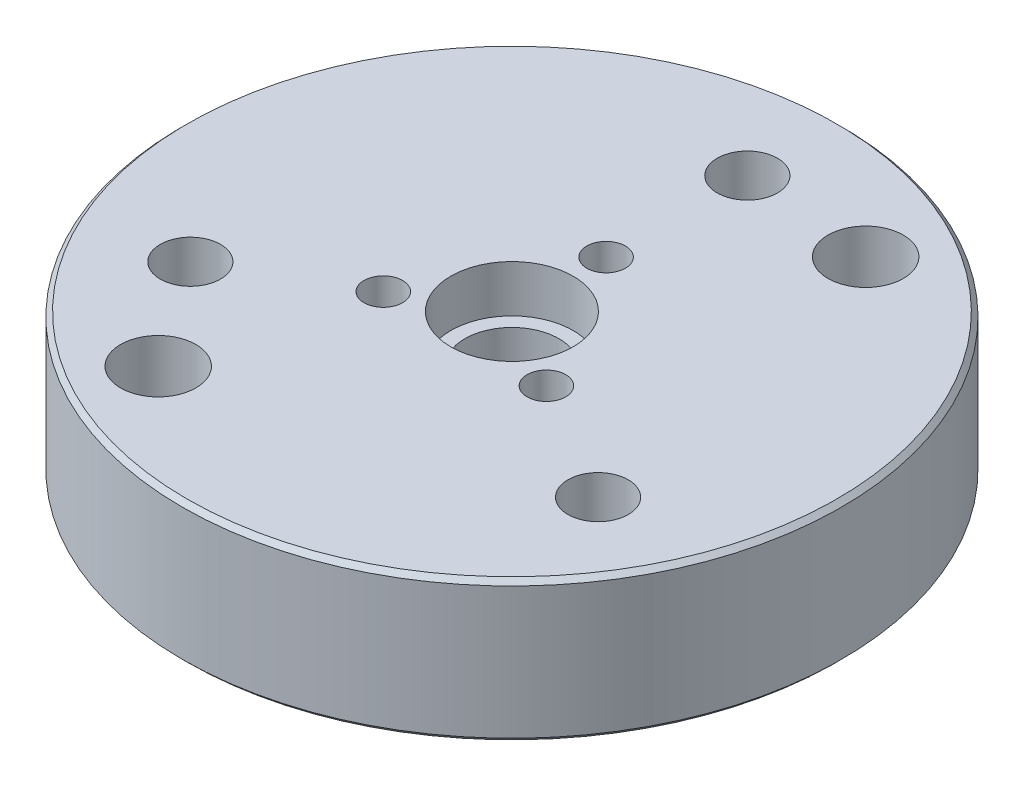
ISO-10303-21;
HEADER;
FILE_DESCRIPTION(('STEP AP214'),'2;1');
FILE_NAME('part.step','',(''),(''),'','','');
FILE_SCHEMA(('AUTOMOTIVE_DESIGN { 1 0 10303 214 1 1 1 1 }'));
ENDSEC;
DATA;
#1=APPLICATION_CONTEXT('core data for automotive mechanical design processes');
#2=APPLICATION_PROTOCOL_DEFINITION('international standard','automotive_design',2000,#1);
#3=PRODUCT_CONTEXT('',#1,'mechanical');
#4=PRODUCT('Part','Part','',(#3));
#5=PRODUCT_RELATED_PRODUCT_CATEGORY('part','',(#4));
#6=PRODUCT_DEFINITION_FORMATION('','',#4);
#7=PRODUCT_DEFINITION_CONTEXT('part definition',#1,'design');
#8=PRODUCT_DEFINITION('design','',#6,#7);
#9=PRODUCT_DEFINITION_SHAPE('','',#8);
#10=(LENGTH_UNIT() NAMED_UNIT(*) SI_UNIT(.MILLI.,.METRE.));
#11=(NAMED_UNIT(*) PLANE_ANGLE_UNIT() SI_UNIT($,.RADIAN.));
#12=(NAMED_UNIT(*) SI_UNIT($,.STERADIAN.) SOLID_ANGLE_UNIT());
#13=UNCERTAINTY_MEASURE_WITH_UNIT(LENGTH_MEASURE(1.E-05),#10,'distance_accuracy_value','');
#14=(GEOMETRIC_REPRESENTATION_CONTEXT(3) GLOBAL_UNCERTAINTY_ASSIGNED_CONTEXT((#13)) GLOBAL_UNIT_ASSIGNED_CONTEXT((#10,
#11,#12)) REPRESENTATION_CONTEXT('',''));
#15=CARTESIAN_POINT('',(0.,0.,0.));
#16=DIRECTION('',(0.,0.,1.));
#17=DIRECTION('',(1.,0.,0.));
#18=AXIS2_PLACEMENT_3D('',#15,#16,#17);
#19=CARTESIAN_POINT('',(0.,-0.000999999999999265,0.));
#20=DIRECTION('',(0.,1.,0.));
#21=DIRECTION('',(0.,0.,1.));
#22=AXIS2_PLACEMENT_3D('',#19,#20,#21);
#23=CYLINDRICAL_SURFACE('',#22,5.);
#24=CARTESIAN_POINT('',(0.,0.,0.));
#25=DIRECTION('',(0.,1.,0.));
#26=DIRECTION('',(0.,0.,1.));
#27=AXIS2_PLACEMENT_3D('',#24,#25,#26);
#28=CIRCLE('',#27,5.);
#29=CARTESIAN_POINT('',(0.,0.,5.));
#30=VERTEX_POINT('',#29);
#31=EDGE_CURVE('E61',#30,#30,#28,.F.);
#32=CARTESIAN_POINT('',(0.,10.,0.));
#33=DIRECTION('',(0.,1.,0.));
#34=DIRECTION('',(0.,0.,1.));
#35=AXIS2_PLACEMENT_3D('',#32,#33,#34);
#36=CIRCLE('',#35,5.);
#37=CARTESIAN_POINT('',(0.,10.,5.));
#38=VERTEX_POINT('',#37);
#39=EDGE_CURVE('E62',#38,#38,#36,.F.);
#40=CARTESIAN_POINT('',(0.,0.,5.));
#41=CARTESIAN_POINT('',(0.,0.104166666666667,5.));
#42=CARTESIAN_POINT('',(0.,0.208333333333333,5.));
#43=CARTESIAN_POINT('',(0.,0.416666666666667,5.));
#44=CARTESIAN_POINT('',(0.,0.520833333333333,5.));
#45=CARTESIAN_POINT('',(0.,0.729166666666667,5.));
#46=CARTESIAN_POINT('',(0.,0.833333333333333,5.));
#47=CARTESIAN_POINT('',(0.,1.04166666666667,5.));
#48=CARTESIAN_POINT('',(0.,1.14583333333333,5.));
#49=CARTESIAN_POINT('',(0.,1.35416666666667,5.));
#50=CARTESIAN_POINT('',(0.,1.45833333333333,5.));
#51=CARTESIAN_POINT('',(0.,1.66666666666667,5.));
#52=CARTESIAN_POINT('',(0.,1.77083333333333,5.));
#53=CARTESIAN_POINT('',(0.,1.97916666666667,5.));
#54=CARTESIAN_POINT('',(0.,2.08333333333333,5.));
#55=CARTESIAN_POINT('',(0.,2.29166666666667,5.));
#56=CARTESIAN_POINT('',(0.,2.39583333333333,5.));
#57=CARTESIAN_POINT('',(0.,2.60416666666667,5.));
#58=CARTESIAN_POINT('',(0.,2.70833333333333,5.));
#59=CARTESIAN_POINT('',(0.,2.91666666666667,5.));
#60=CARTESIAN_POINT('',(0.,3.02083333333333,5.));
#61=CARTESIAN_POINT('',(0.,3.22916666666667,5.));
#62=CARTESIAN_POINT('',(0.,3.33333333333333,5.));
#63=CARTESIAN_POINT('',(0.,3.54166666666667,5.));
#64=CARTESIAN_POINT('',(0.,3.64583333333333,5.));
#65=CARTESIAN_POINT('',(0.,3.85416666666667,5.));
#66=CARTESIAN_POINT('',(0.,3.95833333333333,5.));
#67=CARTESIAN_POINT('',(0.,4.16666666666667,5.));
#68=CARTESIAN_POINT('',(0.,4.27083333333333,5.));
#69=CARTESIAN_POINT('',(0.,4.47916666666667,5.));
#70=CARTESIAN_POINT('',(0.,4.58333333333333,5.));
#71=CARTESIAN_POINT('',(0.,4.79166666666667,5.));
#72=CARTESIAN_POINT('',(0.,4.89583333333333,5.));
#73=CARTESIAN_POINT('',(0.,5.10416666666667,5.));
#74=CARTESIAN_POINT('',(0.,5.20833333333333,5.));
#75=CARTESIAN_POINT('',(0.,5.41666666666667,5.));
#76=CARTESIAN_POINT('',(0.,5.52083333333333,5.));
#77=CARTESIAN_POINT('',(0.,5.72916666666667,5.));
#78=CARTESIAN_POINT('',(0.,5.83333333333333,5.));
#79=CARTESIAN_POINT('',(0.,6.04166666666667,5.));
#80=CARTESIAN_POINT('',(0.,6.14583333333333,5.));
#81=CARTESIAN_POINT('',(0.,6.35416666666667,5.));
#82=CARTESIAN_POINT('',(0.,6.45833333333333,5.));
#83=CARTESIAN_POINT('',(0.,6.66666666666667,5.));
#84=CARTESIAN_POINT('',(0.,6.77083333333333,5.));
#85=CARTESIAN_POINT('',(0.,6.97916666666667,5.));
#86=CARTESIAN_POINT('',(0.,7.08333333333333,5.));
#87=CARTESIAN_POINT('',(0.,7.29166666666667,5.));
#88=CARTESIAN_POINT('',(0.,7.39583333333333,5.));
#89=CARTESIAN_POINT('',(0.,7.60416666666667,5.));
#90=CARTESIAN_POINT('',(0.,7.70833333333333,5.));
#91=CARTESIAN_POINT('',(0.,7.91666666666667,5.));
#92=CARTESIAN_POINT('',(0.,8.02083333333333,5.));
#93=CARTESIAN_POINT('',(0.,8.22916666666667,5.));
#94=CARTESIAN_POINT('',(0.,8.33333333333333,5.));
#95=CARTESIAN_POINT('',(0.,8.54166666666667,5.));
#96=CARTESIAN_POINT('',(0.,8.64583333333333,5.));
#97=CARTESIAN_POINT('',(0.,8.85416666666666,5.));
#98=CARTESIAN_POINT('',(0.,8.95833333333333,5.));
#99=CARTESIAN_POINT('',(0.,9.16666666666666,5.));
#100=CARTESIAN_POINT('',(0.,9.27083333333333,5.));
#101=CARTESIAN_POINT('',(0.,9.47916666666667,5.));
#102=CARTESIAN_POINT('',(0.,9.58333333333333,5.));
#103=CARTESIAN_POINT('',(0.,9.79166666666667,5.));
#104=CARTESIAN_POINT('',(0.,9.89583333333333,5.));
#105=CARTESIAN_POINT('',(0.,10.,5.));
#106=B_SPLINE_CURVE_WITH_KNOTS('',3,(#40,#41,#42,#43,#44,#45,#46,#47,#48,#49,#50,#51,#52,#53,
#54,#55,#56,#57,#58,#59,#60,#61,#62,#63,#64,#65,#66,#67,#68,#69,#70,#71,#72,#73,#74,#75,#76,#77,
#78,#79,#80,#81,#82,#83,#84,#85,#86,#87,#88,#89,#90,#91,#92,#93,#94,#95,#96,#97,#98,#99,#100,
#101,#102,#103,#104,#105),.UNSPECIFIED.,.F.,.F.,(4,2,2,2,2,2,2,2,2,2,2,2,2,2,2,2,2,2,2,2,2,2,2,
2,2,2,2,2,2,2,2,2,4),(0.,0.3125,0.625,0.9375,1.25,1.5625,1.875,2.1875,2.5,2.8125,3.125,3.4375,
3.75,4.0625,4.375,4.6875,5.,5.3125,5.625,5.9375,6.25,6.5625,6.875,7.1875,7.5,7.8125,8.125,
8.4375,8.75,9.0625,9.375,9.6875,10.),.UNSPECIFIED.);
#107=EDGE_CURVE('BSEAM40',#30,#38,#106,.T.);
#108=ORIENTED_EDGE('',*,*,#31,.T.);
#109=ORIENTED_EDGE('',*,*,#39,.F.);
#110=ORIENTED_EDGE('',*,*,#107,.T.);
#111=ORIENTED_EDGE('',*,*,#107,.F.);
#112=EDGE_LOOP('',(#108,#110,#109,#111));
#113=FACE_BOUND('',#112,.T.);
#114=ADVANCED_FACE('F40',(#113),#23,.F.);
#115=CARTESIAN_POINT('',(0.,15.,0.));
#116=DIRECTION('',(0.,-1.,0.));
#117=DIRECTION('',(0.,0.,-1.));
#118=AXIS2_PLACEMENT_3D('',#115,#116,#117);
#119=CYLINDRICAL_SURFACE('',#118,35.);
#120=CARTESIAN_POINT('',(0.,0.500000000000014,0.));
#121=DIRECTION('',(0.,1.,0.));
#122=DIRECTION('',(0.,0.,1.));
#123=AXIS2_PLACEMENT_3D('',#120,#121,#122);
#124=CIRCLE('',#123,35.);
#125=CARTESIAN_POINT('',(0.,0.500000000000014,35.));
#126=VERTEX_POINT('',#125);
#127=EDGE_CURVE('E52',#126,#126,#124,.T.);
#128=ORIENTED_EDGE('',*,*,#127,.T.);
#129=EDGE_LOOP('',(#128));
#130=FACE_BOUND('',#129,.T.);
#131=CARTESIAN_POINT('',(0.,14.5,0.));
#132=DIRECTION('',(0.,1.,0.));
#133=DIRECTION('',(0.,0.,1.));
#134=AXIS2_PLACEMENT_3D('',#131,#132,#133);
#135=CIRCLE('',#134,35.);
#136=CARTESIAN_POINT('',(0.,14.5,35.));
#137=VERTEX_POINT('',#136);
#138=EDGE_CURVE('E56',#137,#137,#135,.F.);
#139=ORIENTED_EDGE('',*,*,#138,.T.);
#140=EDGE_LOOP('',(#139));
#141=FACE_BOUND('',#140,.T.);
#142=ADVANCED_FACE('F148',(#130,#141),#119,.T.);
#143=CARTESIAN_POINT('',(0.,15.,0.));
#144=DIRECTION('',(0.,1.,0.));
#145=DIRECTION('',(0.,0.,1.));
#146=AXIS2_PLACEMENT_3D('',#143,#144,#145);
#147=PLANE('',#146);
#148=CARTESIAN_POINT('',(0.,15.,0.));
#149=DIRECTION('',(0.,1.,0.));
#150=DIRECTION('',(0.,0.,1.));
#151=AXIS2_PLACEMENT_3D('',#148,#149,#150);
#152=CIRCLE('',#151,34.5);
#153=CARTESIAN_POINT('',(0.,15.,34.5));
#154=VERTEX_POINT('',#153);
#155=EDGE_CURVE('E10',#154,#154,#152,.T.);
#156=ORIENTED_EDGE('',*,*,#155,.T.);
#157=EDGE_LOOP('',(#156));
#158=FACE_BOUND('',#157,.T.);
#159=CARTESIAN_POINT('',(13.75,15.,-23.815698604072));
#160=DIRECTION('',(0.,-1.,0.));
#161=DIRECTION('',(0.,0.,-1.));
#162=AXIS2_PLACEMENT_3D('',#159,#160,#161);
#163=CIRCLE('',#162,4.);
#164=CARTESIAN_POINT('',(13.75,15.,-27.815698604072));
#165=VERTEX_POINT('',#164);
#166=EDGE_CURVE('E115',#165,#165,#163,.T.);
#167=ORIENTED_EDGE('',*,*,#166,.T.);
#168=EDGE_LOOP('',(#167));
#169=FACE_BOUND('',#168,.T.);
#170=CARTESIAN_POINT('',(-13.75,15.,23.815698604072));
#171=DIRECTION('',(0.,-1.,0.));
#172=DIRECTION('',(0.,0.,-1.));
#173=AXIS2_PLACEMENT_3D('',#170,#171,#172);
#174=CIRCLE('',#173,4.);
#175=CARTESIAN_POINT('',(-13.75,15.,19.8156986040721));
#176=VERTEX_POINT('',#175);
#177=EDGE_CURVE('E109',#176,#176,#174,.T.);
#178=ORIENTED_EDGE('',*,*,#177,.T.);
#179=EDGE_LOOP('',(#178));
#180=FACE_BOUND('',#179,.T.);
#181=CARTESIAN_POINT('',(0.,15.,-25.));
#182=DIRECTION('',(0.,-1.,0.));
#183=DIRECTION('',(0.,0.,-1.));
#184=AXIS2_PLACEMENT_3D('',#181,#182,#183);
#185=CIRCLE('',#184,3.2);
#186=CARTESIAN_POINT('',(0.,15.,-28.2));
#187=VERTEX_POINT('',#186);
#188=EDGE_CURVE('E103',#187,#187,#185,.T.);
#189=ORIENTED_EDGE('',*,*,#188,.T.);
#190=EDGE_LOOP('',(#189));
#191=FACE_BOUND('',#190,.T.);
#192=CARTESIAN_POINT('',(-21.650635094611,15.,12.4999999999999));
#193=DIRECTION('',(0.,-1.,0.));
#194=DIRECTION('',(0.,0.,-1.));
#195=AXIS2_PLACEMENT_3D('',#192,#193,#194);
#196=CIRCLE('',#195,3.2);
#197=CARTESIAN_POINT('',(-21.650635094611,15.,9.29999999999995));
#198=VERTEX_POINT('',#197);
#199=EDGE_CURVE('E97',#198,#198,#196,.T.);
#200=ORIENTED_EDGE('',*,*,#199,.T.);
#201=EDGE_LOOP('',(#200));
#202=FACE_BOUND('',#201,.T.);
#203=CARTESIAN_POINT('',(21.650635094611,15.,12.5));
#204=DIRECTION('',(0.,-1.,0.));
#205=DIRECTION('',(0.,0.,-1.));
#206=AXIS2_PLACEMENT_3D('',#203,#204,#205);
#207=CIRCLE('',#206,3.2);
#208=CARTESIAN_POINT('',(21.650635094611,15.,9.29999999999996));
#209=VERTEX_POINT('',#208);
#210=EDGE_CURVE('E81',#209,#209,#207,.T.);
#211=ORIENTED_EDGE('',*,*,#210,.T.);
#212=EDGE_LOOP('',(#211));
#213=FACE_BOUND('',#212,.T.);
#214=CARTESIAN_POINT('',(0.,15.,-10.));
#215=DIRECTION('',(0.,1.,0.));
#216=DIRECTION('',(0.,0.,1.));
#217=AXIS2_PLACEMENT_3D('',#214,#215,#216);
#218=CIRCLE('',#217,2.05);
#219=CARTESIAN_POINT('',(0.,15.,-7.95));
#220=VERTEX_POINT('',#219);
#221=EDGE_CURVE('E85',#220,#220,#218,.T.);
#222=ORIENTED_EDGE('',*,*,#221,.F.);
#223=EDGE_LOOP('',(#222));
#224=FACE_BOUND('',#223,.T.);
#225=CARTESIAN_POINT('',(8.66025403784439,15.,4.99999999999998));
#226=DIRECTION('',(0.,1.,0.));
#227=DIRECTION('',(0.,0.,1.));
#228=AXIS2_PLACEMENT_3D('',#225,#226,#227);
#229=CIRCLE('',#228,2.05);
#230=CARTESIAN_POINT('',(8.66025403784439,15.,7.04999999999997));
#231=VERTEX_POINT('',#230);
#232=EDGE_CURVE('E82',#231,#231,#229,.T.);
#233=ORIENTED_EDGE('',*,*,#232,.F.);
#234=EDGE_LOOP('',(#233));
#235=FACE_BOUND('',#234,.T.);
#236=CARTESIAN_POINT('',(-8.6602540378444,15.,4.99999999999998));
#237=DIRECTION('',(0.,1.,0.));
#238=DIRECTION('',(0.,0.,1.));
#239=AXIS2_PLACEMENT_3D('',#236,#237,#238);
#240=CIRCLE('',#239,2.05);
#241=CARTESIAN_POINT('',(-8.6602540378444,15.,7.04999999999998));
#242=VERTEX_POINT('',#241);
#243=EDGE_CURVE('E74',#242,#242,#240,.T.);
#244=ORIENTED_EDGE('',*,*,#243,.F.);
#245=EDGE_LOOP('',(#244));
#246=FACE_BOUND('',#245,.T.);
#247=CARTESIAN_POINT('',(0.,15.,0.));
#248=DIRECTION('',(0.,1.,0.));
#249=DIRECTION('',(0.,0.,1.));
#250=AXIS2_PLACEMENT_3D('',#247,#248,#249);
#251=CIRCLE('',#250,6.5);
#252=CARTESIAN_POINT('',(0.,15.,6.5));
#253=VERTEX_POINT('',#252);
#254=EDGE_CURVE('E68',#253,#253,#251,.T.);
#255=ORIENTED_EDGE('',*,*,#254,.F.);
#256=EDGE_LOOP('',(#255));
#257=FACE_BOUND('',#256,.T.);
#258=ADVANCED_FACE('F128',(#158,#169,#180,#191,#202,#213,#224,#235,#246,#257),#147,.T.);
#259=CARTESIAN_POINT('',(0.,0.,0.));
#260=DIRECTION('',(0.,1.,0.));
#261=DIRECTION('',(0.,0.,1.));
#262=AXIS2_PLACEMENT_3D('',#259,#260,#261);
#263=PLANE('',#262);
#264=CARTESIAN_POINT('',(0.,0.,0.));
#265=DIRECTION('',(0.,1.,0.));
#266=DIRECTION('',(0.,0.,1.));
#267=AXIS2_PLACEMENT_3D('',#264,#265,#266);
#268=CIRCLE('',#267,34.5);
#269=CARTESIAN_POINT('',(0.,0.,34.5));
#270=VERTEX_POINT('',#269);
#271=EDGE_CURVE('E48',#270,#270,#268,.F.);
#272=ORIENTED_EDGE('',*,*,#271,.T.);
#273=EDGE_LOOP('',(#272));
#274=FACE_BOUND('',#273,.T.);
#275=CARTESIAN_POINT('',(13.75,0.,-23.815698604072));
#276=DIRECTION('',(0.,-1.,0.));
#277=DIRECTION('',(0.,0.,-1.));
#278=AXIS2_PLACEMENT_3D('',#275,#276,#277);
#279=CIRCLE('',#278,4.);
#280=CARTESIAN_POINT('',(13.75,0.,-27.815698604072));
#281=VERTEX_POINT('',#280);
#282=EDGE_CURVE('E118',#281,#281,#279,.T.);
#283=ORIENTED_EDGE('',*,*,#282,.F.);
#284=EDGE_LOOP('',(#283));
#285=FACE_BOUND('',#284,.T.);
#286=CARTESIAN_POINT('',(-13.75,0.,23.815698604072));
#287=DIRECTION('',(0.,-1.,0.));
#288=DIRECTION('',(0.,0.,-1.));
#289=AXIS2_PLACEMENT_3D('',#286,#287,#288);
#290=CIRCLE('',#289,4.);
#291=CARTESIAN_POINT('',(-13.75,0.,19.8156986040721));
#292=VERTEX_POINT('',#291);
#293=EDGE_CURVE('E112',#292,#292,#290,.T.);
#294=ORIENTED_EDGE('',*,*,#293,.F.);
#295=EDGE_LOOP('',(#294));
#296=FACE_BOUND('',#295,.T.);
#297=CARTESIAN_POINT('',(0.,0.,-25.));
#298=DIRECTION('',(0.,-1.,0.));
#299=DIRECTION('',(0.,0.,-1.));
#300=AXIS2_PLACEMENT_3D('',#297,#298,#299);
#301=CIRCLE('',#300,3.2);
#302=CARTESIAN_POINT('',(0.,0.,-28.2));
#303=VERTEX_POINT('',#302);
#304=EDGE_CURVE('E106',#303,#303,#301,.T.);
#305=ORIENTED_EDGE('',*,*,#304,.F.);
#306=EDGE_LOOP('',(#305));
#307=FACE_BOUND('',#306,.T.);
#308=CARTESIAN_POINT('',(-21.650635094611,0.,12.4999999999999));
#309=DIRECTION('',(0.,-1.,0.));
#310=DIRECTION('',(0.,0.,-1.));
#311=AXIS2_PLACEMENT_3D('',#308,#309,#310);
#312=CIRCLE('',#311,3.2);
#313=CARTESIAN_POINT('',(-21.650635094611,0.,9.29999999999995));
#314=VERTEX_POINT('',#313);
#315=EDGE_CURVE('E100',#314,#314,#312,.T.);
#316=ORIENTED_EDGE('',*,*,#315,.F.);
#317=EDGE_LOOP('',(#316));
#318=FACE_BOUND('',#317,.T.);
#319=CARTESIAN_POINT('',(21.650635094611,0.,12.5));
#320=DIRECTION('',(0.,-1.,0.));
#321=DIRECTION('',(0.,0.,-1.));
#322=AXIS2_PLACEMENT_3D('',#319,#320,#321);
#323=CIRCLE('',#322,3.2);
#324=CARTESIAN_POINT('',(21.650635094611,0.,9.29999999999996));
#325=VERTEX_POINT('',#324);
#326=EDGE_CURVE('E94',#325,#325,#323,.T.);
#327=ORIENTED_EDGE('',*,*,#326,.F.);
#328=EDGE_LOOP('',(#327));
#329=FACE_BOUND('',#328,.T.);
#330=CARTESIAN_POINT('',(0.,0.,-10.));
#331=DIRECTION('',(0.,1.,0.));
#332=DIRECTION('',(0.,0.,1.));
#333=AXIS2_PLACEMENT_3D('',#330,#331,#332);
#334=CIRCLE('',#333,2.05);
#335=CARTESIAN_POINT('',(0.,0.,-7.95));
#336=VERTEX_POINT('',#335);
#337=EDGE_CURVE('E71',#336,#336,#334,.F.);
#338=ORIENTED_EDGE('',*,*,#337,.F.);
#339=EDGE_LOOP('',(#338));
#340=FACE_BOUND('',#339,.T.);
#341=CARTESIAN_POINT('',(8.66025403784439,0.,4.99999999999998));
#342=DIRECTION('',(0.,1.,0.));
#343=DIRECTION('',(0.,0.,1.));
#344=AXIS2_PLACEMENT_3D('',#341,#342,#343);
#345=CIRCLE('',#344,2.05);
#346=CARTESIAN_POINT('',(8.66025403784439,0.,7.04999999999997));
#347=VERTEX_POINT('',#346);
#348=EDGE_CURVE('E77',#347,#347,#345,.F.);
#349=ORIENTED_EDGE('',*,*,#348,.F.);
#350=EDGE_LOOP('',(#349));
#351=FACE_BOUND('',#350,.T.);
#352=CARTESIAN_POINT('',(-8.6602540378444,0.,4.99999999999998));
#353=DIRECTION('',(0.,1.,0.));
#354=DIRECTION('',(0.,0.,1.));
#355=AXIS2_PLACEMENT_3D('',#352,#353,#354);
#356=CIRCLE('',#355,2.05);
#357=CARTESIAN_POINT('',(-8.6602540378444,0.,7.04999999999998));
#358=VERTEX_POINT('',#357);
#359=EDGE_CURVE('E78',#358,#358,#356,.F.);
#360=ORIENTED_EDGE('',*,*,#359,.F.);
#361=EDGE_LOOP('',(#360));
#362=FACE_BOUND('',#361,.T.);
#363=ORIENTED_EDGE('',*,*,#31,.F.);
#364=EDGE_LOOP('',(#363));
#365=FACE_BOUND('',#364,.T.);
#366=ADVANCED_FACE('F124',(#274,#285,#296,#307,#318,#329,#340,#351,#362,#365),#263,.F.);
#367=CARTESIAN_POINT('',(0.,10.,0.));
#368=DIRECTION('',(0.,1.,0.));
#369=DIRECTION('',(0.,0.,1.));
#370=AXIS2_PLACEMENT_3D('',#367,#368,#369);
#371=PLANE('',#370);
#372=CARTESIAN_POINT('',(0.,10.,0.));
#373=DIRECTION('',(0.,1.,0.));
#374=DIRECTION('',(0.,0.,1.));
#375=AXIS2_PLACEMENT_3D('',#372,#373,#374);
#376=CIRCLE('',#375,6.5);
#377=CARTESIAN_POINT('',(0.,10.,6.5));
#378=VERTEX_POINT('',#377);
#379=EDGE_CURVE('E65',#378,#378,#376,.T.);
#380=ORIENTED_EDGE('',*,*,#379,.T.);
#381=EDGE_LOOP('',(#380));
#382=FACE_BOUND('',#381,.T.);
#383=ORIENTED_EDGE('',*,*,#39,.T.);
#384=EDGE_LOOP('',(#383));
#385=FACE_BOUND('',#384,.T.);
#386=ADVANCED_FACE('F127',(#382,#385),#371,.T.);
#387=CARTESIAN_POINT('',(0.,10.,0.));
#388=DIRECTION('',(0.,1.,0.));
#389=DIRECTION('',(0.,0.,1.));
#390=AXIS2_PLACEMENT_3D('',#387,#388,#389);
#391=CYLINDRICAL_SURFACE('',#390,6.5);
#392=ORIENTED_EDGE('',*,*,#379,.F.);
#393=EDGE_LOOP('',(#392));
#394=FACE_BOUND('',#393,.T.);
#395=ORIENTED_EDGE('',*,*,#254,.T.);
#396=EDGE_LOOP('',(#395));
#397=FACE_BOUND('',#396,.T.);
#398=ADVANCED_FACE('F153',(#394,#397),#391,.F.);
#399=CARTESIAN_POINT('',(-8.6602540378444,-0.000999999999999265,4.99999999999998));
#400=DIRECTION('',(0.,1.,0.));
#401=DIRECTION('',(0.,0.,1.));
#402=AXIS2_PLACEMENT_3D('',#399,#400,#401);
#403=CYLINDRICAL_SURFACE('',#402,2.05);
#404=CARTESIAN_POINT('',(-8.6602540378444,15.,7.04999999999998));
#405=CARTESIAN_POINT('',(-8.6602540378444,14.84375,7.04999999999998));
#406=CARTESIAN_POINT('',(-8.6602540378444,14.6875,7.04999999999998));
#407=CARTESIAN_POINT('',(-8.6602540378444,14.375,7.04999999999998));
#408=CARTESIAN_POINT('',(-8.6602540378444,14.21875,7.04999999999998));
#409=CARTESIAN_POINT('',(-8.6602540378444,13.90625,7.04999999999998));
#410=CARTESIAN_POINT('',(-8.6602540378444,13.75,7.04999999999998));
#411=CARTESIAN_POINT('',(-8.6602540378444,13.4375,7.04999999999998));
#412=CARTESIAN_POINT('',(-8.6602540378444,13.28125,7.04999999999998));
#413=CARTESIAN_POINT('',(-8.6602540378444,12.96875,7.04999999999998));
#414=CARTESIAN_POINT('',(-8.6602540378444,12.8125,7.04999999999998));
#415=CARTESIAN_POINT('',(-8.6602540378444,12.5,7.04999999999998));
#416=CARTESIAN_POINT('',(-8.6602540378444,12.34375,7.04999999999998));
#417=CARTESIAN_POINT('',(-8.6602540378444,12.03125,7.04999999999998));
#418=CARTESIAN_POINT('',(-8.6602540378444,11.875,7.04999999999998));
#419=CARTESIAN_POINT('',(-8.6602540378444,11.5625,7.04999999999998));
#420=CARTESIAN_POINT('',(-8.6602540378444,11.40625,7.04999999999998));
#421=CARTESIAN_POINT('',(-8.6602540378444,11.09375,7.04999999999998));
#422=CARTESIAN_POINT('',(-8.6602540378444,10.9375,7.04999999999998));
#423=CARTESIAN_POINT('',(-8.6602540378444,10.625,7.04999999999998));
#424=CARTESIAN_POINT('',(-8.6602540378444,10.46875,7.04999999999998));
#425=CARTESIAN_POINT('',(-8.6602540378444,10.15625,7.04999999999998));
#426=CARTESIAN_POINT('',(-8.6602540378444,10.,7.04999999999998));
#427=CARTESIAN_POINT('',(-8.6602540378444,9.6875,7.04999999999998));
#428=CARTESIAN_POINT('',(-8.6602540378444,9.53125,7.04999999999998));
#429=CARTESIAN_POINT('',(-8.6602540378444,9.21875,7.04999999999998));
#430=CARTESIAN_POINT('',(-8.6602540378444,9.0625,7.04999999999998));
#431=CARTESIAN_POINT('',(-8.6602540378444,8.75,7.04999999999998));
#432=CARTESIAN_POINT('',(-8.6602540378444,8.59375,7.04999999999998));
#433=CARTESIAN_POINT('',(-8.6602540378444,8.28125,7.04999999999998));
#434=CARTESIAN_POINT('',(-8.6602540378444,8.125,7.04999999999998));
#435=CARTESIAN_POINT('',(-8.6602540378444,7.8125,7.04999999999998));
#436=CARTESIAN_POINT('',(-8.6602540378444,7.65625,7.04999999999998));
#437=CARTESIAN_POINT('',(-8.6602540378444,7.34375,7.04999999999998));
#438=CARTESIAN_POINT('',(-8.6602540378444,7.1875,7.04999999999998));
#439=CARTESIAN_POINT('',(-8.6602540378444,6.875,7.04999999999998));
#440=CARTESIAN_POINT('',(-8.6602540378444,6.71875,7.04999999999998));
#441=CARTESIAN_POINT('',(-8.6602540378444,6.40625,7.04999999999998));
#442=CARTESIAN_POINT('',(-8.6602540378444,6.25,7.04999999999998));
#443=CARTESIAN_POINT('',(-8.6602540378444,5.9375,7.04999999999998));
#444=CARTESIAN_POINT('',(-8.6602540378444,5.78125,7.04999999999998));
#445=CARTESIAN_POINT('',(-8.6602540378444,5.46875,7.04999999999998));
#446=CARTESIAN_POINT('',(-8.6602540378444,5.3125,7.04999999999998));
#447=CARTESIAN_POINT('',(-8.6602540378444,5.,7.04999999999998));
#448=CARTESIAN_POINT('',(-8.6602540378444,4.84375,7.04999999999998));
#449=CARTESIAN_POINT('',(-8.6602540378444,4.53125,7.04999999999998));
#450=CARTESIAN_POINT('',(-8.6602540378444,4.375,7.04999999999998));
#451=CARTESIAN_POINT('',(-8.6602540378444,4.0625,7.04999999999998));
#452=CARTESIAN_POINT('',(-8.6602540378444,3.90625,7.04999999999998));
#453=CARTESIAN_POINT('',(-8.6602540378444,3.59375,7.04999999999998));
#454=CARTESIAN_POINT('',(-8.6602540378444,3.4375,7.04999999999998));
#455=CARTESIAN_POINT('',(-8.6602540378444,3.125,7.04999999999998));
#456=CARTESIAN_POINT('',(-8.6602540378444,2.96875,7.04999999999998));
#457=CARTESIAN_POINT('',(-8.6602540378444,2.65625,7.04999999999998));
#458=CARTESIAN_POINT('',(-8.6602540378444,2.5,7.04999999999998));
#459=CARTESIAN_POINT('',(-8.6602540378444,2.1875,7.04999999999998));
#460=CARTESIAN_POINT('',(-8.6602540378444,2.03125,7.04999999999998));
#461=CARTESIAN_POINT('',(-8.6602540378444,1.71875,7.04999999999998));
#462=CARTESIAN_POINT('',(-8.6602540378444,1.5625,7.04999999999998));
#463=CARTESIAN_POINT('',(-8.6602540378444,1.25,7.04999999999998));
#464=CARTESIAN_POINT('',(-8.6602540378444,1.09375,7.04999999999998));
#465=CARTESIAN_POINT('',(-8.6602540378444,0.781250000000001,7.04999999999998));
#466=CARTESIAN_POINT('',(-8.6602540378444,0.625,7.04999999999998));
#467=CARTESIAN_POINT('',(-8.6602540378444,0.3125,7.04999999999998));
#468=CARTESIAN_POINT('',(-8.6602540378444,0.15625,7.04999999999998));
#469=CARTESIAN_POINT('',(-8.6602540378444,0.,7.04999999999998));
#470=B_SPLINE_CURVE_WITH_KNOTS('',3,(#404,#405,#406,#407,#408,#409,#410,#411,#412,#413,#414,
#415,#416,#417,#418,#419,#420,#421,#422,#423,#424,#425,#426,#427,#428,#429,#430,#431,#432,#433,
#434,#435,#436,#437,#438,#439,#440,#441,#442,#443,#444,#445,#446,#447,#448,#449,#450,#451,#452,
#453,#454,#455,#456,#457,#458,#459,#460,#461,#462,#463,#464,#465,#466,#467,#468,#469),
.UNSPECIFIED.,.F.,.F.,(4,2,2,2,2,2,2,2,2,2,2,2,2,2,2,2,2,2,2,2,2,2,2,2,2,2,2,2,2,2,2,2,4),(0.,
0.46875,0.937500000000001,1.40625,1.875,2.34375,2.8125,3.28125,3.75,4.21875,4.6875,5.15625,
5.625,6.09375,6.5625,7.03125,7.5,7.96875,8.4375,8.90625,9.375,9.84375,10.3125,10.78125,11.25,
11.71875,12.1875,12.65625,13.125,13.59375,14.0625,14.53125,15.),.UNSPECIFIED.);
#471=EDGE_CURVE('BSEAM159',#242,#358,#470,.T.);
#472=ORIENTED_EDGE('',*,*,#243,.T.);
#473=ORIENTED_EDGE('',*,*,#359,.T.);
#474=ORIENTED_EDGE('',*,*,#471,.T.);
#475=ORIENTED_EDGE('',*,*,#471,.F.);
#476=EDGE_LOOP('',(#472,#474,#473,#475));
#477=FACE_BOUND('',#476,.T.);
#478=ADVANCED_FACE('F159',(#477),#403,.F.);
#479=CARTESIAN_POINT('',(8.66025403784439,-0.000999999999999265,4.99999999999998));
#480=DIRECTION('',(0.,1.,0.));
#481=DIRECTION('',(0.,0.,1.));
#482=AXIS2_PLACEMENT_3D('',#479,#480,#481);
#483=CYLINDRICAL_SURFACE('',#482,2.05);
#484=CARTESIAN_POINT('',(8.66025403784439,15.,7.04999999999997));
#485=CARTESIAN_POINT('',(8.66025403784439,14.84375,7.04999999999997));
#486=CARTESIAN_POINT('',(8.66025403784439,14.6875,7.04999999999997));
#487=CARTESIAN_POINT('',(8.66025403784439,14.375,7.04999999999997));
#488=CARTESIAN_POINT('',(8.66025403784439,14.21875,7.04999999999997));
#489=CARTESIAN_POINT('',(8.66025403784439,13.90625,7.04999999999997));
#490=CARTESIAN_POINT('',(8.66025403784439,13.75,7.04999999999997));
#491=CARTESIAN_POINT('',(8.66025403784439,13.4375,7.04999999999997));
#492=CARTESIAN_POINT('',(8.66025403784439,13.28125,7.04999999999997));
#493=CARTESIAN_POINT('',(8.66025403784439,12.96875,7.04999999999997));
#494=CARTESIAN_POINT('',(8.66025403784439,12.8125,7.04999999999997));
#495=CARTESIAN_POINT('',(8.66025403784439,12.5,7.04999999999997));
#496=CARTESIAN_POINT('',(8.66025403784439,12.34375,7.04999999999997));
#497=CARTESIAN_POINT('',(8.66025403784439,12.03125,7.04999999999997));
#498=CARTESIAN_POINT('',(8.66025403784439,11.875,7.04999999999997));
#499=CARTESIAN_POINT('',(8.66025403784439,11.5625,7.04999999999997));
#500=CARTESIAN_POINT('',(8.66025403784439,11.40625,7.04999999999997));
#501=CARTESIAN_POINT('',(8.66025403784439,11.09375,7.04999999999997));
#502=CARTESIAN_POINT('',(8.66025403784439,10.9375,7.04999999999997));
#503=CARTESIAN_POINT('',(8.66025403784439,10.625,7.04999999999997));
#504=CARTESIAN_POINT('',(8.66025403784439,10.46875,7.04999999999997));
#505=CARTESIAN_POINT('',(8.66025403784439,10.15625,7.04999999999997));
#506=CARTESIAN_POINT('',(8.66025403784439,10.,7.04999999999997));
#507=CARTESIAN_POINT('',(8.66025403784439,9.6875,7.04999999999997));
#508=CARTESIAN_POINT('',(8.66025403784439,9.53125,7.04999999999997));
#509=CARTESIAN_POINT('',(8.66025403784439,9.21875,7.04999999999997));
#510=CARTESIAN_POINT('',(8.66025403784439,9.0625,7.04999999999997));
#511=CARTESIAN_POINT('',(8.66025403784439,8.75,7.04999999999997));
#512=CARTESIAN_POINT('',(8.66025403784439,8.59375,7.04999999999997));
#513=CARTESIAN_POINT('',(8.66025403784439,8.28125,7.04999999999997));
#514=CARTESIAN_POINT('',(8.66025403784439,8.125,7.04999999999997));
#515=CARTESIAN_POINT('',(8.66025403784439,7.8125,7.04999999999997));
#516=CARTESIAN_POINT('',(8.66025403784439,7.65625,7.04999999999997));
#517=CARTESIAN_POINT('',(8.66025403784439,7.34375,7.04999999999997));
#518=CARTESIAN_POINT('',(8.66025403784439,7.1875,7.04999999999997));
#519=CARTESIAN_POINT('',(8.66025403784439,6.875,7.04999999999997));
#520=CARTESIAN_POINT('',(8.66025403784439,6.71875,7.04999999999997));
#521=CARTESIAN_POINT('',(8.66025403784439,6.40625,7.04999999999997));
#522=CARTESIAN_POINT('',(8.66025403784439,6.25,7.04999999999997));
#523=CARTESIAN_POINT('',(8.66025403784439,5.9375,7.04999999999997));
#524=CARTESIAN_POINT('',(8.66025403784439,5.78125,7.04999999999997));
#525=CARTESIAN_POINT('',(8.66025403784439,5.46875,7.04999999999997));
#526=CARTESIAN_POINT('',(8.66025403784439,5.3125,7.04999999999997));
#527=CARTESIAN_POINT('',(8.66025403784439,5.,7.04999999999997));
#528=CARTESIAN_POINT('',(8.66025403784439,4.84375,7.04999999999997));
#529=CARTESIAN_POINT('',(8.66025403784439,4.53125,7.04999999999997));
#530=CARTESIAN_POINT('',(8.66025403784439,4.375,7.04999999999997));
#531=CARTESIAN_POINT('',(8.66025403784439,4.0625,7.04999999999997));
#532=CARTESIAN_POINT('',(8.66025403784439,3.90625,7.04999999999997));
#533=CARTESIAN_POINT('',(8.66025403784439,3.59375,7.04999999999997));
#534=CARTESIAN_POINT('',(8.66025403784439,3.4375,7.04999999999997));
#535=CARTESIAN_POINT('',(8.66025403784439,3.125,7.04999999999997));
#536=CARTESIAN_POINT('',(8.66025403784439,2.96875,7.04999999999997));
#537=CARTESIAN_POINT('',(8.66025403784439,2.65625,7.04999999999997));
#538=CARTESIAN_POINT('',(8.66025403784439,2.5,7.04999999999997));
#539=CARTESIAN_POINT('',(8.66025403784439,2.1875,7.04999999999997));
#540=CARTESIAN_POINT('',(8.66025403784439,2.03125,7.04999999999997));
#541=CARTESIAN_POINT('',(8.66025403784439,1.71875,7.04999999999997));
#542=CARTESIAN_POINT('',(8.66025403784439,1.5625,7.04999999999997));
#543=CARTESIAN_POINT('',(8.66025403784439,1.25,7.04999999999997));
#544=CARTESIAN_POINT('',(8.66025403784439,1.09375,7.04999999999997));
#545=CARTESIAN_POINT('',(8.66025403784439,0.781250000000001,7.04999999999997));
#546=CARTESIAN_POINT('',(8.66025403784439,0.625,7.04999999999997));
#547=CARTESIAN_POINT('',(8.66025403784439,0.3125,7.04999999999997));
#548=CARTESIAN_POINT('',(8.66025403784439,0.15625,7.04999999999997));
#549=CARTESIAN_POINT('',(8.66025403784439,0.,7.04999999999997));
#550=B_SPLINE_CURVE_WITH_KNOTS('',3,(#484,#485,#486,#487,#488,#489,#490,#491,#492,#493,#494,
#495,#496,#497,#498,#499,#500,#501,#502,#503,#504,#505,#506,#507,#508,#509,#510,#511,#512,#513,
#514,#515,#516,#517,#518,#519,#520,#521,#522,#523,#524,#525,#526,#527,#528,#529,#530,#531,#532,
#533,#534,#535,#536,#537,#538,#539,#540,#541,#542,#543,#544,#545,#546,#547,#548,#549),
.UNSPECIFIED.,.F.,.F.,(4,2,2,2,2,2,2,2,2,2,2,2,2,2,2,2,2,2,2,2,2,2,2,2,2,2,2,2,2,2,2,2,4),(0.,
0.46875,0.937500000000001,1.40625,1.875,2.34375,2.8125,3.28125,3.75,4.21875,4.6875,5.15625,
5.625,6.09375,6.5625,7.03125,7.5,7.96875,8.4375,8.90625,9.375,9.84375,10.3125,10.78125,11.25,
11.71875,12.1875,12.65625,13.125,13.59375,14.0625,14.53125,15.),.UNSPECIFIED.);
#551=EDGE_CURVE('BSEAM209',#231,#347,#550,.T.);
#552=ORIENTED_EDGE('',*,*,#232,.T.);
#553=ORIENTED_EDGE('',*,*,#348,.T.);
#554=ORIENTED_EDGE('',*,*,#551,.T.);
#555=ORIENTED_EDGE('',*,*,#551,.F.);
#556=EDGE_LOOP('',(#552,#554,#553,#555));
#557=FACE_BOUND('',#556,.T.);
#558=ADVANCED_FACE('F209',(#557),#483,.F.);
#559=CARTESIAN_POINT('',(0.,-0.000999999999999265,-10.));
#560=DIRECTION('',(0.,1.,0.));
#561=DIRECTION('',(0.,0.,1.));
#562=AXIS2_PLACEMENT_3D('',#559,#560,#561);
#563=CYLINDRICAL_SURFACE('',#562,2.05);
#564=CARTESIAN_POINT('',(0.,15.,-7.95));
#565=CARTESIAN_POINT('',(0.,14.84375,-7.95));
#566=CARTESIAN_POINT('',(0.,14.6875,-7.95));
#567=CARTESIAN_POINT('',(0.,14.375,-7.95));
#568=CARTESIAN_POINT('',(0.,14.21875,-7.95));
#569=CARTESIAN_POINT('',(0.,13.90625,-7.95));
#570=CARTESIAN_POINT('',(0.,13.75,-7.95));
#571=CARTESIAN_POINT('',(0.,13.4375,-7.95));
#572=CARTESIAN_POINT('',(0.,13.28125,-7.95));
#573=CARTESIAN_POINT('',(0.,12.96875,-7.95));
#574=CARTESIAN_POINT('',(0.,12.8125,-7.95));
#575=CARTESIAN_POINT('',(0.,12.5,-7.95));
#576=CARTESIAN_POINT('',(0.,12.34375,-7.95));
#577=CARTESIAN_POINT('',(0.,12.03125,-7.95));
#578=CARTESIAN_POINT('',(0.,11.875,-7.95));
#579=CARTESIAN_POINT('',(0.,11.5625,-7.95));
#580=CARTESIAN_POINT('',(0.,11.40625,-7.95));
#581=CARTESIAN_POINT('',(0.,11.09375,-7.95));
#582=CARTESIAN_POINT('',(0.,10.9375,-7.95));
#583=CARTESIAN_POINT('',(0.,10.625,-7.95));
#584=CARTESIAN_POINT('',(0.,10.46875,-7.95));
#585=CARTESIAN_POINT('',(0.,10.15625,-7.95));
#586=CARTESIAN_POINT('',(0.,10.,-7.95));
#587=CARTESIAN_POINT('',(0.,9.6875,-7.95));
#588=CARTESIAN_POINT('',(0.,9.53125,-7.95));
#589=CARTESIAN_POINT('',(0.,9.21875,-7.95));
#590=CARTESIAN_POINT('',(0.,9.0625,-7.95));
#591=CARTESIAN_POINT('',(0.,8.75,-7.95));
#592=CARTESIAN_POINT('',(0.,8.59375,-7.95));
#593=CARTESIAN_POINT('',(0.,8.28125,-7.95));
#594=CARTESIAN_POINT('',(0.,8.125,-7.95));
#595=CARTESIAN_POINT('',(0.,7.8125,-7.95));
#596=CARTESIAN_POINT('',(0.,7.65625,-7.95));
#597=CARTESIAN_POINT('',(0.,7.34375,-7.95));
#598=CARTESIAN_POINT('',(0.,7.1875,-7.95));
#599=CARTESIAN_POINT('',(0.,6.875,-7.95));
#600=CARTESIAN_POINT('',(0.,6.71875,-7.95));
#601=CARTESIAN_POINT('',(0.,6.40625,-7.95));
#602=CARTESIAN_POINT('',(0.,6.25,-7.95));
#603=CARTESIAN_POINT('',(0.,5.9375,-7.95));
#604=CARTESIAN_POINT('',(0.,5.78125,-7.95));
#605=CARTESIAN_POINT('',(0.,5.46875,-7.95));
#606=CARTESIAN_POINT('',(0.,5.3125,-7.95));
#607=CARTESIAN_POINT('',(0.,5.,-7.95));
#608=CARTESIAN_POINT('',(0.,4.84375,-7.95));
#609=CARTESIAN_POINT('',(0.,4.53125,-7.95));
#610=CARTESIAN_POINT('',(0.,4.375,-7.95));
#611=CARTESIAN_POINT('',(0.,4.0625,-7.95));
#612=CARTESIAN_POINT('',(0.,3.90625,-7.95));
#613=CARTESIAN_POINT('',(0.,3.59375,-7.95));
#614=CARTESIAN_POINT('',(0.,3.4375,-7.95));
#615=CARTESIAN_POINT('',(0.,3.125,-7.95));
#616=CARTESIAN_POINT('',(0.,2.96875,-7.95));
#617=CARTESIAN_POINT('',(0.,2.65625,-7.95));
#618=CARTESIAN_POINT('',(0.,2.5,-7.95));
#619=CARTESIAN_POINT('',(0.,2.1875,-7.95));
#620=CARTESIAN_POINT('',(0.,2.03125,-7.95));
#621=CARTESIAN_POINT('',(0.,1.71875,-7.95));
#622=CARTESIAN_POINT('',(0.,1.5625,-7.95));
#623=CARTESIAN_POINT('',(0.,1.25,-7.95));
#624=CARTESIAN_POINT('',(0.,1.09375,-7.95));
#625=CARTESIAN_POINT('',(0.,0.781250000000001,-7.95));
#626=CARTESIAN_POINT('',(0.,0.625,-7.95));
#627=CARTESIAN_POINT('',(0.,0.3125,-7.95));
#628=CARTESIAN_POINT('',(0.,0.15625,-7.95));
#629=CARTESIAN_POINT('',(0.,0.,-7.95));
#630=B_SPLINE_CURVE_WITH_KNOTS('',3,(#564,#565,#566,#567,#568,#569,#570,#571,#572,#573,#574,
#575,#576,#577,#578,#579,#580,#581,#582,#583,#584,#585,#586,#587,#588,#589,#590,#591,#592,#593,
#594,#595,#596,#597,#598,#599,#600,#601,#602,#603,#604,#605,#606,#607,#608,#609,#610,#611,#612,
#613,#614,#615,#616,#617,#618,#619,#620,#621,#622,#623,#624,#625,#626,#627,#628,#629),
.UNSPECIFIED.,.F.,.F.,(4,2,2,2,2,2,2,2,2,2,2,2,2,2,2,2,2,2,2,2,2,2,2,2,2,2,2,2,2,2,2,2,4),(0.,
0.46875,0.937500000000001,1.40625,1.875,2.34375,2.8125,3.28125,3.75,4.21875,4.6875,5.15625,
5.625,6.09375,6.5625,7.03125,7.5,7.96875,8.4375,8.90625,9.375,9.84375,10.3125,10.78125,11.25,
11.71875,12.1875,12.65625,13.125,13.59375,14.0625,14.53125,15.),.UNSPECIFIED.);
#631=EDGE_CURVE('BSEAM206',#220,#336,#630,.T.);
#632=ORIENTED_EDGE('',*,*,#221,.T.);
#633=ORIENTED_EDGE('',*,*,#337,.T.);
#634=ORIENTED_EDGE('',*,*,#631,.T.);
#635=ORIENTED_EDGE('',*,*,#631,.F.);
#636=EDGE_LOOP('',(#632,#634,#633,#635));
#637=FACE_BOUND('',#636,.T.);
#638=ADVANCED_FACE('F206',(#637),#563,.F.);
#639=CARTESIAN_POINT('',(21.650635094611,0.,12.5));
#640=DIRECTION('',(0.,-1.,0.));
#641=DIRECTION('',(0.,0.,-1.));
#642=AXIS2_PLACEMENT_3D('',#639,#640,#641);
#643=CYLINDRICAL_SURFACE('',#642,3.2);
#644=ORIENTED_EDGE('',*,*,#210,.F.);
#645=EDGE_LOOP('',(#644));
#646=FACE_BOUND('',#645,.T.);
#647=ORIENTED_EDGE('',*,*,#326,.T.);
#648=EDGE_LOOP('',(#647));
#649=FACE_BOUND('',#648,.T.);
#650=ADVANCED_FACE('F202',(#646,#649),#643,.F.);
#651=CARTESIAN_POINT('',(-21.650635094611,0.,12.4999999999999));
#652=DIRECTION('',(0.,-1.,0.));
#653=DIRECTION('',(0.,0.,-1.));
#654=AXIS2_PLACEMENT_3D('',#651,#652,#653);
#655=CYLINDRICAL_SURFACE('',#654,3.2);
#656=ORIENTED_EDGE('',*,*,#199,.F.);
#657=EDGE_LOOP('',(#656));
#658=FACE_BOUND('',#657,.T.);
#659=ORIENTED_EDGE('',*,*,#315,.T.);
#660=EDGE_LOOP('',(#659));
#661=FACE_BOUND('',#660,.T.);
#662=ADVANCED_FACE('F198',(#658,#661),#655,.F.);
#663=CARTESIAN_POINT('',(0.,0.,-25.));
#664=DIRECTION('',(0.,-1.,0.));
#665=DIRECTION('',(0.,0.,-1.));
#666=AXIS2_PLACEMENT_3D('',#663,#664,#665);
#667=CYLINDRICAL_SURFACE('',#666,3.2);
#668=ORIENTED_EDGE('',*,*,#188,.F.);
#669=EDGE_LOOP('',(#668));
#670=FACE_BOUND('',#669,.T.);
#671=ORIENTED_EDGE('',*,*,#304,.T.);
#672=EDGE_LOOP('',(#671));
#673=FACE_BOUND('',#672,.T.);
#674=ADVANCED_FACE('F191',(#670,#673),#667,.F.);
#675=CARTESIAN_POINT('',(-13.75,0.,23.815698604072));
#676=DIRECTION('',(0.,-1.,0.));
#677=DIRECTION('',(0.,0.,-1.));
#678=AXIS2_PLACEMENT_3D('',#675,#676,#677);
#679=CYLINDRICAL_SURFACE('',#678,4.);
#680=ORIENTED_EDGE('',*,*,#177,.F.);
#681=EDGE_LOOP('',(#680));
#682=FACE_BOUND('',#681,.T.);
#683=ORIENTED_EDGE('',*,*,#293,.T.);
#684=EDGE_LOOP('',(#683));
#685=FACE_BOUND('',#684,.T.);
#686=ADVANCED_FACE('F180',(#682,#685),#679,.F.);
#687=CARTESIAN_POINT('',(13.75,0.,-23.815698604072));
#688=DIRECTION('',(0.,-1.,0.));
#689=DIRECTION('',(0.,0.,-1.));
#690=AXIS2_PLACEMENT_3D('',#687,#688,#689);
#691=CYLINDRICAL_SURFACE('',#690,4.);
#692=ORIENTED_EDGE('',*,*,#166,.F.);
#693=EDGE_LOOP('',(#692));
#694=FACE_BOUND('',#693,.T.);
#695=ORIENTED_EDGE('',*,*,#282,.T.);
#696=EDGE_LOOP('',(#695));
#697=FACE_BOUND('',#696,.T.);
#698=ADVANCED_FACE('F122',(#694,#697),#691,.F.);
#699=CARTESIAN_POINT('',(0.,0.500000000000014,0.));
#700=DIRECTION('',(0.,1.,0.));
#701=DIRECTION('',(0.,0.,1.));
#702=AXIS2_PLACEMENT_3D('',#699,#700,#701);
#703=CONICAL_SURFACE('',#702,35.,0.785398163397441);
#704=ORIENTED_EDGE('',*,*,#271,.F.);
#705=EDGE_LOOP('',(#704));
#706=FACE_BOUND('',#705,.T.);
#707=ORIENTED_EDGE('',*,*,#127,.F.);
#708=EDGE_LOOP('',(#707));
#709=FACE_BOUND('',#708,.T.);
#710=ADVANCED_FACE('F170',(#706,#709),#703,.T.);
#711=CARTESIAN_POINT('',(0.,15.,0.));
#712=DIRECTION('',(0.,-1.,0.));
#713=DIRECTION('',(0.,0.,-1.));
#714=AXIS2_PLACEMENT_3D('',#711,#712,#713);
#715=CONICAL_SURFACE('',#714,34.5,0.785398163397441);
#716=ORIENTED_EDGE('',*,*,#138,.F.);
#717=EDGE_LOOP('',(#716));
#718=FACE_BOUND('',#717,.T.);
#719=ORIENTED_EDGE('',*,*,#155,.F.);
#720=EDGE_LOOP('',(#719));
#721=FACE_BOUND('',#720,.T.);
#722=ADVANCED_FACE('F43',(#718,#721),#715,.T.);
#723=CLOSED_SHELL('',(#114,#142,#258,#366,#386,#398,#478,#558,#638,#650,#662,#674,#686,#698,
#710,#722));
#724=MANIFOLD_SOLID_BREP('B2',#723);
#725=ADVANCED_BREP_SHAPE_REPRESENTATION('',(#18,#724),#14);
#726=SHAPE_DEFINITION_REPRESENTATION(#9,#725);
ENDSEC;
END-ISO-10303-21;
